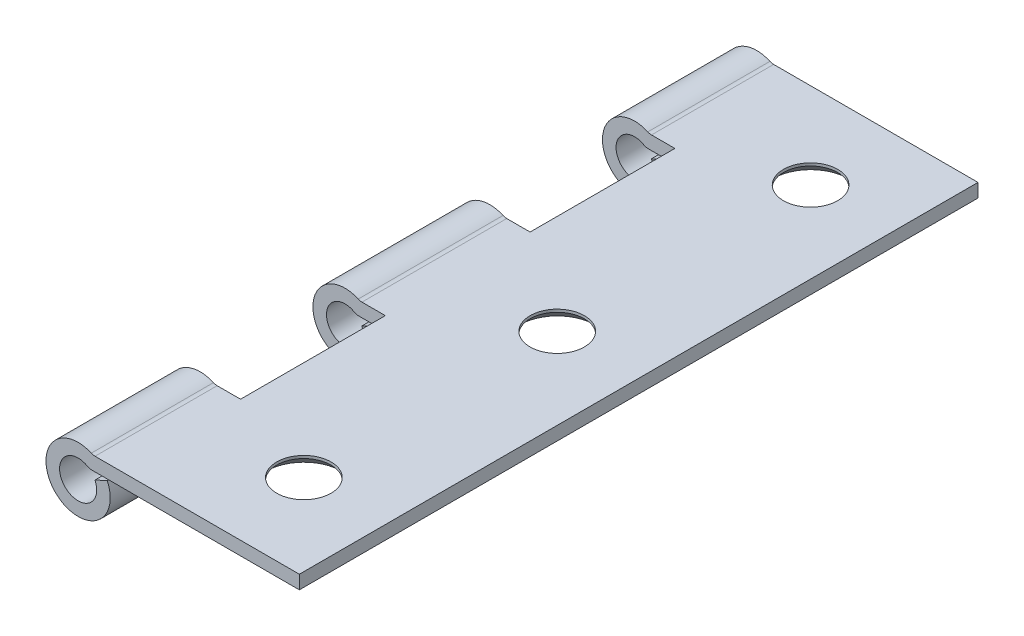
ISO-10303-21;
HEADER;
FILE_DESCRIPTION(('STEP AP214'),'2;1');
FILE_NAME('part.step','',(''),(''),'','','');
FILE_SCHEMA(('AUTOMOTIVE_DESIGN { 1 0 10303 214 1 1 1 1 }'));
ENDSEC;
DATA;
#1=APPLICATION_CONTEXT('core data for automotive mechanical design processes');
#2=APPLICATION_PROTOCOL_DEFINITION('international standard','automotive_design',2000,#1);
#3=PRODUCT_CONTEXT('',#1,'mechanical');
#4=PRODUCT('Part','Part','',(#3));
#5=PRODUCT_RELATED_PRODUCT_CATEGORY('part','',(#4));
#6=PRODUCT_DEFINITION_FORMATION('','',#4);
#7=PRODUCT_DEFINITION_CONTEXT('part definition',#1,'design');
#8=PRODUCT_DEFINITION('design','',#6,#7);
#9=PRODUCT_DEFINITION_SHAPE('','',#8);
#10=(LENGTH_UNIT() NAMED_UNIT(*) SI_UNIT(.MILLI.,.METRE.));
#11=(NAMED_UNIT(*) PLANE_ANGLE_UNIT() SI_UNIT($,.RADIAN.));
#12=(NAMED_UNIT(*) SI_UNIT($,.STERADIAN.) SOLID_ANGLE_UNIT());
#13=UNCERTAINTY_MEASURE_WITH_UNIT(LENGTH_MEASURE(1.E-05),#10,'distance_accuracy_value','');
#14=(GEOMETRIC_REPRESENTATION_CONTEXT(3) GLOBAL_UNCERTAINTY_ASSIGNED_CONTEXT((#13)) GLOBAL_UNIT_ASSIGNED_CONTEXT((#10,
#11,#12)) REPRESENTATION_CONTEXT('',''));
#15=CARTESIAN_POINT('',(0.,0.,0.));
#16=DIRECTION('',(0.,0.,1.));
#17=DIRECTION('',(1.,0.,0.));
#18=AXIS2_PLACEMENT_3D('',#15,#16,#17);
#19=CARTESIAN_POINT('',(3.21739264398012,1.50029482917946,37.5));
#20=DIRECTION('',(0.422618261740694,-0.906307787036653,0.));
#21=DIRECTION('',(0.906307787036653,0.422618261740694,0.));
#22=AXIS2_PLACEMENT_3D('',#19,#20,#21);
#23=PLANE('',#22);
#24=DIRECTION('',(0.906307787036653,0.422618261740694,0.));
#25=VECTOR('',#24,1.);
#26=CARTESIAN_POINT('',(3.21739264398012,1.50029482917946,24.));
#27=LINE('',#26,#25);
#28=CARTESIAN_POINT('',(1.85793096342514,0.866367436568422,24.));
#29=VERTEX_POINT('',#28);
#30=CARTESIAN_POINT('',(3.21739264398012,1.50029482917946,24.));
#31=VERTEX_POINT('',#30);
#32=EDGE_CURVE('E222',#29,#31,#27,.T.);
#33=ORIENTED_EDGE('',*,*,#32,.F.);
#34=DIRECTION('',(0.,0.,-1.));
#35=VECTOR('',#34,1.);
#36=CARTESIAN_POINT('',(1.85793096342514,0.866367436568422,37.5));
#37=LINE('',#36,#35);
#38=CARTESIAN_POINT('',(1.85793096342514,0.866367436568422,37.5));
#39=VERTEX_POINT('',#38);
#40=EDGE_CURVE('E338',#39,#29,#37,.T.);
#41=ORIENTED_EDGE('',*,*,#40,.F.);
#42=DIRECTION('',(-0.906307787036652,-0.422618261740694,0.));
#43=VECTOR('',#42,1.);
#44=CARTESIAN_POINT('',(3.21739264398012,1.50029482917946,37.5));
#45=LINE('',#44,#43);
#46=CARTESIAN_POINT('',(3.21739264398012,1.50029482917946,37.5));
#47=VERTEX_POINT('',#46);
#48=EDGE_CURVE('E275',#47,#39,#45,.T.);
#49=ORIENTED_EDGE('',*,*,#48,.F.);
#50=DIRECTION('',(0.,0.,-1.));
#51=VECTOR('',#50,1.);
#52=CARTESIAN_POINT('',(3.21739264398012,1.50029482917946,37.5));
#53=LINE('',#52,#51);
#54=EDGE_CURVE('E343',#47,#31,#53,.T.);
#55=ORIENTED_EDGE('',*,*,#54,.T.);
#56=EDGE_LOOP('',(#33,#41,#49,#55));
#57=FACE_BOUND('',#56,.T.);
#58=ADVANCED_FACE('F34',(#57),#23,.F.);
#59=DIRECTION('',(-0.906307787036653,-0.422618261740694,0.));
#60=VECTOR('',#59,1.);
#61=CARTESIAN_POINT('',(3.21739264398012,1.50029482917946,8.));
#62=LINE('',#61,#60);
#63=CARTESIAN_POINT('',(3.21739264398012,1.50029482917946,8.));
#64=VERTEX_POINT('',#63);
#65=CARTESIAN_POINT('',(1.85793096342514,0.866367436568422,8.));
#66=VERTEX_POINT('',#65);
#67=EDGE_CURVE('E424',#64,#66,#62,.T.);
#68=ORIENTED_EDGE('',*,*,#67,.F.);
#69=CARTESIAN_POINT('',(3.21739264398012,1.50029482917946,-8.));
#70=VERTEX_POINT('',#69);
#71=EDGE_CURVE('E347',#64,#70,#53,.T.);
#72=ORIENTED_EDGE('',*,*,#71,.T.);
#73=DIRECTION('',(-0.906307787036653,-0.422618261740694,0.));
#74=VECTOR('',#73,1.);
#75=CARTESIAN_POINT('',(3.21739264398012,1.50029482917946,-8.));
#76=LINE('',#75,#74);
#77=CARTESIAN_POINT('',(1.85793096342514,0.866367436568422,-8.));
#78=VERTEX_POINT('',#77);
#79=EDGE_CURVE('E256',#70,#78,#76,.T.);
#80=ORIENTED_EDGE('',*,*,#79,.T.);
#81=EDGE_CURVE('E342',#66,#78,#37,.T.);
#82=ORIENTED_EDGE('',*,*,#81,.F.);
#83=EDGE_LOOP('',(#68,#72,#80,#82));
#84=FACE_BOUND('',#83,.T.);
#85=ADVANCED_FACE('F423',(#84),#23,.F.);
#86=CARTESIAN_POINT('',(0.,0.,37.5));
#87=DIRECTION('',(0.,0.,-1.));
#88=DIRECTION('',(-1.,0.,0.));
#89=AXIS2_PLACEMENT_3D('',#86,#87,#88);
#90=CYLINDRICAL_SURFACE('',#89,2.05);
#91=CARTESIAN_POINT('',(0.,0.,24.));
#92=DIRECTION('',(0.,0.,-1.));
#93=DIRECTION('',(-1.,0.,0.));
#94=AXIS2_PLACEMENT_3D('',#91,#92,#93);
#95=CIRCLE('',#94,2.05);
#96=CARTESIAN_POINT('',(1.01489577654459,1.78114754098361,24.));
#97=VERTEX_POINT('',#96);
#98=EDGE_CURVE('E224',#97,#29,#95,.F.);
#99=ORIENTED_EDGE('',*,*,#98,.F.);
#100=DIRECTION('',(0.,0.,-1.));
#101=VECTOR('',#100,1.);
#102=CARTESIAN_POINT('',(1.01489577654459,1.78114754098361,37.5));
#103=LINE('',#102,#101);
#104=CARTESIAN_POINT('',(1.01489577654459,1.78114754098361,37.5));
#105=VERTEX_POINT('',#104);
#106=EDGE_CURVE('E333',#105,#97,#103,.T.);
#107=ORIENTED_EDGE('',*,*,#106,.F.);
#108=CARTESIAN_POINT('',(0.,0.,37.5));
#109=DIRECTION('',(0.,0.,-1.));
#110=DIRECTION('',(1.,0.,0.));
#111=AXIS2_PLACEMENT_3D('',#108,#109,#110);
#112=CIRCLE('',#111,2.05);
#113=EDGE_CURVE('E278',#39,#105,#112,.T.);
#114=ORIENTED_EDGE('',*,*,#113,.F.);
#115=ORIENTED_EDGE('',*,*,#40,.T.);
#116=EDGE_LOOP('',(#99,#107,#114,#115));
#117=FACE_BOUND('',#116,.T.);
#118=ADVANCED_FACE('F476',(#117),#90,.F.);
#119=CARTESIAN_POINT('',(0.,0.,8.));
#120=DIRECTION('',(0.,0.,1.));
#121=DIRECTION('',(1.,0.,0.));
#122=AXIS2_PLACEMENT_3D('',#119,#120,#121);
#123=CIRCLE('',#122,2.05);
#124=CARTESIAN_POINT('',(1.01489577654459,1.78114754098361,8.));
#125=VERTEX_POINT('',#124);
#126=EDGE_CURVE('E441',#66,#125,#123,.F.);
#127=ORIENTED_EDGE('',*,*,#126,.F.);
#128=ORIENTED_EDGE('',*,*,#81,.T.);
#129=CARTESIAN_POINT('',(0.,0.,-8.));
#130=DIRECTION('',(0.,0.,1.));
#131=DIRECTION('',(1.,0.,0.));
#132=AXIS2_PLACEMENT_3D('',#129,#130,#131);
#133=CIRCLE('',#132,2.05);
#134=CARTESIAN_POINT('',(1.01489577654459,1.78114754098361,-8.));
#135=VERTEX_POINT('',#134);
#136=EDGE_CURVE('E259',#78,#135,#133,.F.);
#137=ORIENTED_EDGE('',*,*,#136,.T.);
#138=EDGE_CURVE('E337',#125,#135,#103,.T.);
#139=ORIENTED_EDGE('',*,*,#138,.F.);
#140=EDGE_LOOP('',(#127,#128,#137,#139));
#141=FACE_BOUND('',#140,.T.);
#142=ADVANCED_FACE('F440',(#141),#90,.F.);
#143=CARTESIAN_POINT('',(1.50996688705415,2.65,37.5));
#144=DIRECTION('',(0.,0.,-1.));
#145=DIRECTION('',(-1.,0.,0.));
#146=AXIS2_PLACEMENT_3D('',#143,#144,#145);
#147=CYLINDRICAL_SURFACE('',#146,1.);
#148=CARTESIAN_POINT('',(1.50996688705415,2.65,24.));
#149=DIRECTION('',(0.,0.,-1.));
#150=DIRECTION('',(-1.,0.,0.));
#151=AXIS2_PLACEMENT_3D('',#148,#149,#150);
#152=CIRCLE('',#151,1.);
#153=CARTESIAN_POINT('',(1.50996688705415,1.65,24.));
#154=VERTEX_POINT('',#153);
#155=EDGE_CURVE('E226',#154,#97,#152,.T.);
#156=ORIENTED_EDGE('',*,*,#155,.F.);
#157=DIRECTION('',(0.,0.,-1.));
#158=VECTOR('',#157,1.);
#159=CARTESIAN_POINT('',(1.50996688705415,1.65,37.5));
#160=LINE('',#159,#158);
#161=CARTESIAN_POINT('',(1.50996688705415,1.65,37.5));
#162=VERTEX_POINT('',#161);
#163=EDGE_CURVE('E329',#162,#154,#160,.T.);
#164=ORIENTED_EDGE('',*,*,#163,.F.);
#165=CARTESIAN_POINT('',(1.50996688705415,2.65,37.5));
#166=DIRECTION('',(0.,0.,1.));
#167=DIRECTION('',(-1.,0.,0.));
#168=AXIS2_PLACEMENT_3D('',#165,#166,#167);
#169=CIRCLE('',#168,1.);
#170=EDGE_CURVE('E280',#105,#162,#169,.T.);
#171=ORIENTED_EDGE('',*,*,#170,.F.);
#172=ORIENTED_EDGE('',*,*,#106,.T.);
#173=EDGE_LOOP('',(#156,#164,#171,#172));
#174=FACE_BOUND('',#173,.T.);
#175=ADVANCED_FACE('F469',(#174),#147,.T.);
#176=CARTESIAN_POINT('',(1.50996688705415,2.65,8.));
#177=DIRECTION('',(0.,0.,1.));
#178=DIRECTION('',(1.,0.,0.));
#179=AXIS2_PLACEMENT_3D('',#176,#177,#178);
#180=CIRCLE('',#179,1.);
#181=CARTESIAN_POINT('',(1.50996688705415,1.65,8.));
#182=VERTEX_POINT('',#181);
#183=EDGE_CURVE('E197',#125,#182,#180,.T.);
#184=ORIENTED_EDGE('',*,*,#183,.F.);
#185=ORIENTED_EDGE('',*,*,#138,.T.);
#186=CARTESIAN_POINT('',(1.50996688705415,2.65,-8.));
#187=DIRECTION('',(0.,0.,1.));
#188=DIRECTION('',(1.,0.,0.));
#189=AXIS2_PLACEMENT_3D('',#186,#187,#188);
#190=CIRCLE('',#189,1.);
#191=CARTESIAN_POINT('',(1.50996688705415,1.65,-8.));
#192=VERTEX_POINT('',#191);
#193=EDGE_CURVE('E262',#135,#192,#190,.T.);
#194=ORIENTED_EDGE('',*,*,#193,.T.);
#195=EDGE_CURVE('E332',#182,#192,#160,.T.);
#196=ORIENTED_EDGE('',*,*,#195,.F.);
#197=EDGE_LOOP('',(#184,#185,#194,#196));
#198=FACE_BOUND('',#197,.T.);
#199=ADVANCED_FACE('F436',(#198),#147,.T.);
#200=CARTESIAN_POINT('',(1.86547581061776,4.15,37.5));
#201=DIRECTION('',(0.,0.,-1.));
#202=DIRECTION('',(-1.,0.,0.));
#203=AXIS2_PLACEMENT_3D('',#200,#201,#202);
#204=CYLINDRICAL_SURFACE('',#203,1.);
#205=CARTESIAN_POINT('',(1.86547581061776,4.15,24.));
#206=DIRECTION('',(0.,0.,-1.));
#207=DIRECTION('',(-1.,0.,0.));
#208=AXIS2_PLACEMENT_3D('',#205,#206,#207);
#209=CIRCLE('',#208,1.);
#210=CARTESIAN_POINT('',(1.45548112696551,3.23791208791209,24.));
#211=VERTEX_POINT('',#210);
#212=CARTESIAN_POINT('',(1.86547581061776,3.15,24.));
#213=VERTEX_POINT('',#212);
#214=EDGE_CURVE('E215',#211,#213,#209,.F.);
#215=ORIENTED_EDGE('',*,*,#214,.F.);
#216=DIRECTION('',(0.,0.,-1.));
#217=VECTOR('',#216,1.);
#218=CARTESIAN_POINT('',(1.45548112696551,3.23791208791209,37.5));
#219=LINE('',#218,#217);
#220=CARTESIAN_POINT('',(1.45548112696551,3.23791208791209,37.5));
#221=VERTEX_POINT('',#220);
#222=EDGE_CURVE('E313',#221,#211,#219,.T.);
#223=ORIENTED_EDGE('',*,*,#222,.F.);
#224=CARTESIAN_POINT('',(1.86547581061776,4.15,37.5));
#225=DIRECTION('',(0.,0.,-1.));
#226=DIRECTION('',(-1.,0.,0.));
#227=AXIS2_PLACEMENT_3D('',#224,#225,#226);
#228=CIRCLE('',#227,1.);
#229=CARTESIAN_POINT('',(1.86547581061776,3.15,37.5));
#230=VERTEX_POINT('',#229);
#231=EDGE_CURVE('E288',#230,#221,#228,.T.);
#232=ORIENTED_EDGE('',*,*,#231,.F.);
#233=DIRECTION('',(0.,0.,-1.));
#234=VECTOR('',#233,1.);
#235=CARTESIAN_POINT('',(1.86547581061776,3.15,37.5));
#236=LINE('',#235,#234);
#237=EDGE_CURVE('E318',#230,#213,#236,.T.);
#238=ORIENTED_EDGE('',*,*,#237,.T.);
#239=EDGE_LOOP('',(#215,#223,#232,#238));
#240=FACE_BOUND('',#239,.T.);
#241=ADVANCED_FACE('F453',(#240),#204,.F.);
#242=CARTESIAN_POINT('',(1.86547581061776,4.15,8.));
#243=DIRECTION('',(0.,0.,1.));
#244=DIRECTION('',(1.,0.,0.));
#245=AXIS2_PLACEMENT_3D('',#242,#243,#244);
#246=CIRCLE('',#245,1.);
#247=CARTESIAN_POINT('',(1.86547581061776,3.15,8.));
#248=VERTEX_POINT('',#247);
#249=CARTESIAN_POINT('',(1.45548112696551,3.23791208791209,8.));
#250=VERTEX_POINT('',#249);
#251=EDGE_CURVE('E383',#248,#250,#246,.F.);
#252=ORIENTED_EDGE('',*,*,#251,.F.);
#253=CARTESIAN_POINT('',(1.86547581061776,3.15,-8.));
#254=VERTEX_POINT('',#253);
#255=EDGE_CURVE('E322',#248,#254,#236,.T.);
#256=ORIENTED_EDGE('',*,*,#255,.T.);
#257=CARTESIAN_POINT('',(1.86547581061776,4.15,-8.));
#258=DIRECTION('',(0.,0.,1.));
#259=DIRECTION('',(1.,0.,0.));
#260=AXIS2_PLACEMENT_3D('',#257,#258,#259);
#261=CIRCLE('',#260,1.);
#262=CARTESIAN_POINT('',(1.45548112696551,3.23791208791209,-8.));
#263=VERTEX_POINT('',#262);
#264=EDGE_CURVE('E374',#254,#263,#261,.F.);
#265=ORIENTED_EDGE('',*,*,#264,.T.);
#266=EDGE_CURVE('E317',#250,#263,#219,.T.);
#267=ORIENTED_EDGE('',*,*,#266,.F.);
#268=EDGE_LOOP('',(#252,#256,#265,#267));
#269=FACE_BOUND('',#268,.T.);
#270=ADVANCED_FACE('F388',(#269),#204,.F.);
#271=CARTESIAN_POINT('',(0.,0.,37.5));
#272=DIRECTION('',(0.,0.,-1.));
#273=DIRECTION('',(-1.,0.,0.));
#274=AXIS2_PLACEMENT_3D('',#271,#272,#273);
#275=CYLINDRICAL_SURFACE('',#274,3.55);
#276=ORIENTED_EDGE('',*,*,#222,.T.);
#277=CARTESIAN_POINT('',(0.,0.,24.));
#278=DIRECTION('',(0.,0.,-1.));
#279=DIRECTION('',(-1.,0.,0.));
#280=AXIS2_PLACEMENT_3D('',#277,#278,#279);
#281=CIRCLE('',#280,3.55);
#282=EDGE_CURVE('E217',#31,#211,#281,.T.);
#283=ORIENTED_EDGE('',*,*,#282,.F.);
#284=ORIENTED_EDGE('',*,*,#54,.F.);
#285=CARTESIAN_POINT('',(0.,0.,37.5));
#286=DIRECTION('',(0.,0.,1.));
#287=DIRECTION('',(1.,0.,0.));
#288=AXIS2_PLACEMENT_3D('',#285,#286,#287);
#289=CIRCLE('',#288,3.55);
#290=EDGE_CURVE('E272',#221,#47,#289,.T.);
#291=ORIENTED_EDGE('',*,*,#290,.F.);
#292=EDGE_LOOP('',(#276,#283,#284,#291));
#293=FACE_BOUND('',#292,.T.);
#294=ADVANCED_FACE('F493',(#293),#275,.T.);
#295=CARTESIAN_POINT('',(0.,0.,8.));
#296=DIRECTION('',(0.,0.,1.));
#297=DIRECTION('',(1.,0.,0.));
#298=AXIS2_PLACEMENT_3D('',#295,#296,#297);
#299=CIRCLE('',#298,3.55);
#300=EDGE_CURVE('E390',#250,#64,#299,.T.);
#301=ORIENTED_EDGE('',*,*,#300,.F.);
#302=ORIENTED_EDGE('',*,*,#266,.T.);
#303=CARTESIAN_POINT('',(0.,0.,-8.));
#304=DIRECTION('',(0.,0.,1.));
#305=DIRECTION('',(1.,0.,0.));
#306=AXIS2_PLACEMENT_3D('',#303,#304,#305);
#307=CIRCLE('',#306,3.55);
#308=EDGE_CURVE('E253',#263,#70,#307,.T.);
#309=ORIENTED_EDGE('',*,*,#308,.T.);
#310=ORIENTED_EDGE('',*,*,#71,.F.);
#311=EDGE_LOOP('',(#301,#302,#309,#310));
#312=FACE_BOUND('',#311,.T.);
#313=ADVANCED_FACE('F413',(#312),#275,.T.);
#314=CARTESIAN_POINT('',(1.50996688705415,1.65,37.5));
#315=DIRECTION('',(0.,1.,0.));
#316=DIRECTION('',(0.,0.,1.));
#317=AXIS2_PLACEMENT_3D('',#314,#315,#316);
#318=PLANE('',#317);
#319=CARTESIAN_POINT('',(15.45,1.65,28.));
#320=DIRECTION('',(0.,1.,0.));
#321=DIRECTION('',(0.,0.,1.));
#322=AXIS2_PLACEMENT_3D('',#319,#320,#321);
#323=CIRCLE('',#322,4.19999999999998);
#324=CARTESIAN_POINT('',(15.45,1.65,32.2));
#325=VERTEX_POINT('',#324);
#326=EDGE_CURVE('E357',#325,#325,#323,.T.);
#327=ORIENTED_EDGE('',*,*,#326,.T.);
#328=EDGE_LOOP('',(#327));
#329=FACE_BOUND('',#328,.T.);
#330=CARTESIAN_POINT('',(15.45,1.65,0.));
#331=DIRECTION('',(0.,1.,0.));
#332=DIRECTION('',(0.,0.,1.));
#333=AXIS2_PLACEMENT_3D('',#330,#331,#332);
#334=CIRCLE('',#333,4.20000000000003);
#335=CARTESIAN_POINT('',(15.45,1.65,4.20000000000003));
#336=VERTEX_POINT('',#335);
#337=EDGE_CURVE('E360',#336,#336,#334,.T.);
#338=ORIENTED_EDGE('',*,*,#337,.T.);
#339=EDGE_LOOP('',(#338));
#340=FACE_BOUND('',#339,.T.);
#341=CARTESIAN_POINT('',(15.45,1.65,-28.));
#342=DIRECTION('',(0.,1.,0.));
#343=DIRECTION('',(0.,0.,1.));
#344=AXIS2_PLACEMENT_3D('',#341,#342,#343);
#345=CIRCLE('',#344,4.20000000000001);
#346=CARTESIAN_POINT('',(15.45,1.65,-23.8));
#347=VERTEX_POINT('',#346);
#348=EDGE_CURVE('E363',#347,#347,#345,.T.);
#349=ORIENTED_EDGE('',*,*,#348,.T.);
#350=EDGE_LOOP('',(#349));
#351=FACE_BOUND('',#350,.T.);
#352=DIRECTION('',(-1.,0.,0.));
#353=VECTOR('',#352,1.);
#354=CARTESIAN_POINT('',(1.50996688705415,1.65,24.));
#355=LINE('',#354,#353);
#356=CARTESIAN_POINT('',(4.45,1.65,24.));
#357=VERTEX_POINT('',#356);
#358=EDGE_CURVE('E214',#357,#154,#355,.T.);
#359=ORIENTED_EDGE('',*,*,#358,.F.);
#360=DIRECTION('',(0.,0.,1.));
#361=VECTOR('',#360,1.);
#362=CARTESIAN_POINT('',(4.45,1.65,37.5));
#363=LINE('',#362,#361);
#364=CARTESIAN_POINT('',(4.45,1.65,8.));
#365=VERTEX_POINT('',#364);
#366=EDGE_CURVE('E201',#365,#357,#363,.T.);
#367=ORIENTED_EDGE('',*,*,#366,.F.);
#368=DIRECTION('',(1.,0.,0.));
#369=VECTOR('',#368,1.);
#370=CARTESIAN_POINT('',(1.50996688705415,1.65,8.));
#371=LINE('',#370,#369);
#372=EDGE_CURVE('E194',#182,#365,#371,.T.);
#373=ORIENTED_EDGE('',*,*,#372,.F.);
#374=ORIENTED_EDGE('',*,*,#195,.T.);
#375=DIRECTION('',(1.,0.,0.));
#376=VECTOR('',#375,1.);
#377=CARTESIAN_POINT('',(1.50996688705415,1.65,-8.));
#378=LINE('',#377,#376);
#379=CARTESIAN_POINT('',(4.45,1.65,-8.));
#380=VERTEX_POINT('',#379);
#381=EDGE_CURVE('E265',#192,#380,#378,.T.);
#382=ORIENTED_EDGE('',*,*,#381,.T.);
#383=DIRECTION('',(0.,0.,-1.));
#384=VECTOR('',#383,1.);
#385=CARTESIAN_POINT('',(4.44999999999999,1.65,37.5));
#386=LINE('',#385,#384);
#387=CARTESIAN_POINT('',(4.45,1.65,-24.));
#388=VERTEX_POINT('',#387);
#389=EDGE_CURVE('E268',#380,#388,#386,.T.);
#390=ORIENTED_EDGE('',*,*,#389,.T.);
#391=DIRECTION('',(-1.,0.,0.));
#392=VECTOR('',#391,1.);
#393=CARTESIAN_POINT('',(1.50996688705415,1.65,-24.));
#394=LINE('',#393,#392);
#395=CARTESIAN_POINT('',(1.50996688705415,1.65,-24.));
#396=VERTEX_POINT('',#395);
#397=EDGE_CURVE('E247',#388,#396,#394,.T.);
#398=ORIENTED_EDGE('',*,*,#397,.T.);
#399=CARTESIAN_POINT('',(1.50996688705415,1.65,-37.5));
#400=VERTEX_POINT('',#399);
#401=EDGE_CURVE('E328',#396,#400,#160,.T.);
#402=ORIENTED_EDGE('',*,*,#401,.T.);
#403=DIRECTION('',(1.,0.,0.));
#404=VECTOR('',#403,1.);
#405=CARTESIAN_POINT('',(1.50996688705415,1.65,-37.5));
#406=LINE('',#405,#404);
#407=CARTESIAN_POINT('',(24.45,1.65,-37.5));
#408=VERTEX_POINT('',#407);
#409=EDGE_CURVE('E304',#400,#408,#406,.T.);
#410=ORIENTED_EDGE('',*,*,#409,.T.);
#411=DIRECTION('',(0.,0.,-1.));
#412=VECTOR('',#411,1.);
#413=CARTESIAN_POINT('',(24.45,1.65,37.5));
#414=LINE('',#413,#412);
#415=CARTESIAN_POINT('',(24.45,1.65,37.5));
#416=VERTEX_POINT('',#415);
#417=EDGE_CURVE('E325',#416,#408,#414,.T.);
#418=ORIENTED_EDGE('',*,*,#417,.F.);
#419=DIRECTION('',(1.,0.,0.));
#420=VECTOR('',#419,1.);
#421=CARTESIAN_POINT('',(1.50996688705415,1.65,37.5));
#422=LINE('',#421,#420);
#423=EDGE_CURVE('E282',#162,#416,#422,.T.);
#424=ORIENTED_EDGE('',*,*,#423,.F.);
#425=ORIENTED_EDGE('',*,*,#163,.T.);
#426=EDGE_LOOP('',(#359,#367,#373,#374,#382,#390,#398,#402,#410,#418,#424,#425));
#427=FACE_BOUND('',#426,.T.);
#428=ADVANCED_FACE('F212',(#329,#340,#351,#427),#318,.F.);
#429=CARTESIAN_POINT('',(1.86547581061776,3.15,37.5));
#430=DIRECTION('',(0.,-1.,0.));
#431=DIRECTION('',(1.,0.,0.));
#432=AXIS2_PLACEMENT_3D('',#429,#430,#431);
#433=PLANE('',#432);
#434=CARTESIAN_POINT('',(15.45,3.15,0.));
#435=DIRECTION('',(0.,-1.,0.));
#436=DIRECTION('',(1.,0.,0.));
#437=AXIS2_PLACEMENT_3D('',#434,#435,#436);
#438=CIRCLE('',#437,3.);
#439=CARTESIAN_POINT('',(18.45,3.15,0.));
#440=VERTEX_POINT('',#439);
#441=EDGE_CURVE('E295',#440,#440,#438,.T.);
#442=ORIENTED_EDGE('',*,*,#441,.T.);
#443=EDGE_LOOP('',(#442));
#444=FACE_BOUND('',#443,.T.);
#445=CARTESIAN_POINT('',(15.45,3.15,-28.));
#446=DIRECTION('',(0.,-1.,0.));
#447=DIRECTION('',(1.,0.,0.));
#448=AXIS2_PLACEMENT_3D('',#445,#446,#447);
#449=CIRCLE('',#448,3.);
#450=CARTESIAN_POINT('',(18.45,3.15,-28.));
#451=VERTEX_POINT('',#450);
#452=EDGE_CURVE('E350',#451,#451,#449,.T.);
#453=ORIENTED_EDGE('',*,*,#452,.T.);
#454=EDGE_LOOP('',(#453));
#455=FACE_BOUND('',#454,.T.);
#456=CARTESIAN_POINT('',(15.45,3.15,28.));
#457=DIRECTION('',(0.,-1.,0.));
#458=DIRECTION('',(1.,0.,0.));
#459=AXIS2_PLACEMENT_3D('',#456,#457,#458);
#460=CIRCLE('',#459,3.);
#461=CARTESIAN_POINT('',(18.45,3.15,28.));
#462=VERTEX_POINT('',#461);
#463=EDGE_CURVE('E271',#462,#462,#460,.F.);
#464=ORIENTED_EDGE('',*,*,#463,.F.);
#465=EDGE_LOOP('',(#464));
#466=FACE_BOUND('',#465,.T.);
#467=DIRECTION('',(1.,0.,0.));
#468=VECTOR('',#467,1.);
#469=CARTESIAN_POINT('',(1.86547581061776,3.15,24.));
#470=LINE('',#469,#468);
#471=CARTESIAN_POINT('',(4.45,3.15,24.));
#472=VERTEX_POINT('',#471);
#473=EDGE_CURVE('E11',#213,#472,#470,.T.);
#474=ORIENTED_EDGE('',*,*,#473,.F.);
#475=ORIENTED_EDGE('',*,*,#237,.F.);
#476=DIRECTION('',(-1.,0.,0.));
#477=VECTOR('',#476,1.);
#478=CARTESIAN_POINT('',(1.86547581061776,3.15,37.5));
#479=LINE('',#478,#477);
#480=CARTESIAN_POINT('',(24.45,3.15,37.5));
#481=VERTEX_POINT('',#480);
#482=EDGE_CURVE('E286',#481,#230,#479,.T.);
#483=ORIENTED_EDGE('',*,*,#482,.F.);
#484=DIRECTION('',(0.,0.,-1.));
#485=VECTOR('',#484,1.);
#486=CARTESIAN_POINT('',(24.45,3.15,37.5));
#487=LINE('',#486,#485);
#488=CARTESIAN_POINT('',(24.45,3.15,-37.5));
#489=VERTEX_POINT('',#488);
#490=EDGE_CURVE('E321',#481,#489,#487,.T.);
#491=ORIENTED_EDGE('',*,*,#490,.T.);
#492=DIRECTION('',(-1.,0.,0.));
#493=VECTOR('',#492,1.);
#494=CARTESIAN_POINT('',(1.86547581061776,3.15,-37.5));
#495=LINE('',#494,#493);
#496=CARTESIAN_POINT('',(1.86547581061776,3.15,-37.5));
#497=VERTEX_POINT('',#496);
#498=EDGE_CURVE('E308',#489,#497,#495,.T.);
#499=ORIENTED_EDGE('',*,*,#498,.T.);
#500=CARTESIAN_POINT('',(1.86547581061776,3.15,-24.));
#501=VERTEX_POINT('',#500);
#502=EDGE_CURVE('E316',#501,#497,#236,.T.);
#503=ORIENTED_EDGE('',*,*,#502,.F.);
#504=DIRECTION('',(1.,0.,0.));
#505=VECTOR('',#504,1.);
#506=CARTESIAN_POINT('',(1.86547581061776,3.15,-24.));
#507=LINE('',#506,#505);
#508=CARTESIAN_POINT('',(4.45,3.15,-24.));
#509=VERTEX_POINT('',#508);
#510=EDGE_CURVE('E57',#501,#509,#507,.T.);
#511=ORIENTED_EDGE('',*,*,#510,.T.);
#512=DIRECTION('',(0.,0.,1.));
#513=VECTOR('',#512,1.);
#514=CARTESIAN_POINT('',(4.44999999999999,3.15,37.5));
#515=LINE('',#514,#513);
#516=CARTESIAN_POINT('',(4.45,3.15,-8.));
#517=VERTEX_POINT('',#516);
#518=EDGE_CURVE('E377',#509,#517,#515,.T.);
#519=ORIENTED_EDGE('',*,*,#518,.T.);
#520=DIRECTION('',(-1.,0.,0.));
#521=VECTOR('',#520,1.);
#522=CARTESIAN_POINT('',(1.86547581061776,3.15,-8.));
#523=LINE('',#522,#521);
#524=EDGE_CURVE('E250',#517,#254,#523,.T.);
#525=ORIENTED_EDGE('',*,*,#524,.T.);
#526=ORIENTED_EDGE('',*,*,#255,.F.);
#527=DIRECTION('',(-1.,0.,0.));
#528=VECTOR('',#527,1.);
#529=CARTESIAN_POINT('',(1.86547581061776,3.15,8.));
#530=LINE('',#529,#528);
#531=CARTESIAN_POINT('',(4.45,3.15,8.));
#532=VERTEX_POINT('',#531);
#533=EDGE_CURVE('E380',#532,#248,#530,.T.);
#534=ORIENTED_EDGE('',*,*,#533,.F.);
#535=DIRECTION('',(0.,0.,-1.));
#536=VECTOR('',#535,1.);
#537=CARTESIAN_POINT('',(4.45,3.15,37.5));
#538=LINE('',#537,#536);
#539=EDGE_CURVE('E42',#472,#532,#538,.T.);
#540=ORIENTED_EDGE('',*,*,#539,.F.);
#541=EDGE_LOOP('',(#474,#475,#483,#491,#499,#503,#511,#519,#525,#526,#534,#540));
#542=FACE_BOUND('',#541,.T.);
#543=ADVANCED_FACE('F393',(#444,#455,#466,#542),#433,.F.);
#544=CARTESIAN_POINT('',(0.,0.,-24.));
#545=DIRECTION('',(0.,0.,-1.));
#546=DIRECTION('',(-1.,0.,0.));
#547=AXIS2_PLACEMENT_3D('',#544,#545,#546);
#548=CIRCLE('',#547,3.55);
#549=CARTESIAN_POINT('',(3.21739264398012,1.50029482917946,-24.));
#550=VERTEX_POINT('',#549);
#551=CARTESIAN_POINT('',(1.45548112696551,3.23791208791209,-24.));
#552=VERTEX_POINT('',#551);
#553=EDGE_CURVE('E236',#550,#552,#548,.T.);
#554=ORIENTED_EDGE('',*,*,#553,.T.);
#555=CARTESIAN_POINT('',(1.45548112696551,3.23791208791209,-37.5));
#556=VERTEX_POINT('',#555);
#557=EDGE_CURVE('E290',#552,#556,#219,.T.);
#558=ORIENTED_EDGE('',*,*,#557,.T.);
#559=CARTESIAN_POINT('',(0.,0.,-37.5));
#560=DIRECTION('',(0.,0.,1.));
#561=DIRECTION('',(1.,0.,0.));
#562=AXIS2_PLACEMENT_3D('',#559,#560,#561);
#563=CIRCLE('',#562,3.55);
#564=CARTESIAN_POINT('',(3.21739264398012,1.50029482917946,-37.5));
#565=VERTEX_POINT('',#564);
#566=EDGE_CURVE('E291',#556,#565,#563,.T.);
#567=ORIENTED_EDGE('',*,*,#566,.T.);
#568=EDGE_CURVE('E341',#550,#565,#53,.T.);
#569=ORIENTED_EDGE('',*,*,#568,.F.);
#570=EDGE_LOOP('',(#554,#558,#567,#569));
#571=FACE_BOUND('',#570,.T.);
#572=ADVANCED_FACE('F410',(#571),#275,.T.);
#573=CARTESIAN_POINT('',(1.85793096342514,0.866367436568422,-24.));
#574=VERTEX_POINT('',#573);
#575=CARTESIAN_POINT('',(1.85793096342514,0.866367436568422,-37.5));
#576=VERTEX_POINT('',#575);
#577=EDGE_CURVE('E336',#574,#576,#37,.T.);
#578=ORIENTED_EDGE('',*,*,#577,.F.);
#579=DIRECTION('',(0.906307787036653,0.422618261740694,0.));
#580=VECTOR('',#579,1.);
#581=CARTESIAN_POINT('',(3.21739264398012,1.50029482917946,-24.));
#582=LINE('',#581,#580);
#583=EDGE_CURVE('E238',#574,#550,#582,.T.);
#584=ORIENTED_EDGE('',*,*,#583,.T.);
#585=ORIENTED_EDGE('',*,*,#568,.T.);
#586=DIRECTION('',(-0.906307787036652,-0.422618261740694,0.));
#587=VECTOR('',#586,1.);
#588=CARTESIAN_POINT('',(3.21739264398012,1.50029482917946,-37.5));
#589=LINE('',#588,#587);
#590=EDGE_CURVE('E294',#565,#576,#589,.T.);
#591=ORIENTED_EDGE('',*,*,#590,.T.);
#592=EDGE_LOOP('',(#578,#584,#585,#591));
#593=FACE_BOUND('',#592,.T.);
#594=ADVANCED_FACE('F427',(#593),#23,.F.);
#595=CARTESIAN_POINT('',(1.01489577654459,1.78114754098361,-24.));
#596=VERTEX_POINT('',#595);
#597=CARTESIAN_POINT('',(1.01489577654459,1.78114754098361,-37.5));
#598=VERTEX_POINT('',#597);
#599=EDGE_CURVE('E331',#596,#598,#103,.T.);
#600=ORIENTED_EDGE('',*,*,#599,.F.);
#601=CARTESIAN_POINT('',(0.,0.,-24.));
#602=DIRECTION('',(0.,0.,-1.));
#603=DIRECTION('',(-1.,0.,0.));
#604=AXIS2_PLACEMENT_3D('',#601,#602,#603);
#605=CIRCLE('',#604,2.05);
#606=EDGE_CURVE('E241',#596,#574,#605,.F.);
#607=ORIENTED_EDGE('',*,*,#606,.T.);
#608=ORIENTED_EDGE('',*,*,#577,.T.);
#609=CARTESIAN_POINT('',(0.,0.,-37.5));
#610=DIRECTION('',(0.,0.,-1.));
#611=DIRECTION('',(1.,0.,0.));
#612=AXIS2_PLACEMENT_3D('',#609,#610,#611);
#613=CIRCLE('',#612,2.05);
#614=EDGE_CURVE('E298',#576,#598,#613,.T.);
#615=ORIENTED_EDGE('',*,*,#614,.T.);
#616=EDGE_LOOP('',(#600,#607,#608,#615));
#617=FACE_BOUND('',#616,.T.);
#618=ADVANCED_FACE('F431',(#617),#90,.F.);
#619=ORIENTED_EDGE('',*,*,#401,.F.);
#620=CARTESIAN_POINT('',(1.50996688705415,2.65,-24.));
#621=DIRECTION('',(0.,0.,-1.));
#622=DIRECTION('',(-1.,0.,0.));
#623=AXIS2_PLACEMENT_3D('',#620,#621,#622);
#624=CIRCLE('',#623,1.);
#625=EDGE_CURVE('E244',#396,#596,#624,.T.);
#626=ORIENTED_EDGE('',*,*,#625,.T.);
#627=ORIENTED_EDGE('',*,*,#599,.T.);
#628=CARTESIAN_POINT('',(1.50996688705415,2.65,-37.5));
#629=DIRECTION('',(0.,0.,1.));
#630=DIRECTION('',(-1.,0.,0.));
#631=AXIS2_PLACEMENT_3D('',#628,#629,#630);
#632=CIRCLE('',#631,1.);
#633=EDGE_CURVE('E301',#598,#400,#632,.T.);
#634=ORIENTED_EDGE('',*,*,#633,.T.);
#635=EDGE_LOOP('',(#619,#626,#627,#634));
#636=FACE_BOUND('',#635,.T.);
#637=ADVANCED_FACE('F466',(#636),#147,.T.);
#638=CARTESIAN_POINT('',(24.45,3.15,37.5));
#639=DIRECTION('',(-1.,0.,0.));
#640=DIRECTION('',(0.,0.,1.));
#641=AXIS2_PLACEMENT_3D('',#638,#639,#640);
#642=PLANE('',#641);
#643=DIRECTION('',(0.,1.,0.));
#644=VECTOR('',#643,1.);
#645=CARTESIAN_POINT('',(24.45,3.15,-37.5));
#646=LINE('',#645,#644);
#647=EDGE_CURVE('E306',#408,#489,#646,.T.);
#648=ORIENTED_EDGE('',*,*,#647,.T.);
#649=ORIENTED_EDGE('',*,*,#490,.F.);
#650=DIRECTION('',(0.,1.,0.));
#651=VECTOR('',#650,1.);
#652=CARTESIAN_POINT('',(24.45,3.15,37.5));
#653=LINE('',#652,#651);
#654=EDGE_CURVE('E284',#416,#481,#653,.T.);
#655=ORIENTED_EDGE('',*,*,#654,.F.);
#656=ORIENTED_EDGE('',*,*,#417,.T.);
#657=EDGE_LOOP('',(#648,#649,#655,#656));
#658=FACE_BOUND('',#657,.T.);
#659=ADVANCED_FACE('F463',(#658),#642,.F.);
#660=ORIENTED_EDGE('',*,*,#557,.F.);
#661=CARTESIAN_POINT('',(1.86547581061776,4.15,-24.));
#662=DIRECTION('',(0.,0.,-1.));
#663=DIRECTION('',(-1.,0.,0.));
#664=AXIS2_PLACEMENT_3D('',#661,#662,#663);
#665=CIRCLE('',#664,1.);
#666=EDGE_CURVE('E372',#552,#501,#665,.F.);
#667=ORIENTED_EDGE('',*,*,#666,.T.);
#668=ORIENTED_EDGE('',*,*,#502,.T.);
#669=CARTESIAN_POINT('',(1.86547581061776,4.15,-37.5));
#670=DIRECTION('',(0.,0.,-1.));
#671=DIRECTION('',(-1.,0.,0.));
#672=AXIS2_PLACEMENT_3D('',#669,#670,#671);
#673=CIRCLE('',#672,1.);
#674=EDGE_CURVE('E276',#497,#556,#673,.T.);
#675=ORIENTED_EDGE('',*,*,#674,.T.);
#676=EDGE_LOOP('',(#660,#667,#668,#675));
#677=FACE_BOUND('',#676,.T.);
#678=ADVANCED_FACE('F397',(#677),#204,.F.);
#679=CARTESIAN_POINT('',(0.,0.,37.5));
#680=DIRECTION('',(0.,0.,1.));
#681=DIRECTION('',(1.,0.,0.));
#682=AXIS2_PLACEMENT_3D('',#679,#680,#681);
#683=PLANE('',#682);
#684=ORIENTED_EDGE('',*,*,#290,.T.);
#685=ORIENTED_EDGE('',*,*,#48,.T.);
#686=ORIENTED_EDGE('',*,*,#113,.T.);
#687=ORIENTED_EDGE('',*,*,#170,.T.);
#688=ORIENTED_EDGE('',*,*,#423,.T.);
#689=ORIENTED_EDGE('',*,*,#654,.T.);
#690=ORIENTED_EDGE('',*,*,#482,.T.);
#691=ORIENTED_EDGE('',*,*,#231,.T.);
#692=EDGE_LOOP('',(#684,#685,#686,#687,#688,#689,#690,#691));
#693=FACE_BOUND('',#692,.T.);
#694=ADVANCED_FACE('F457',(#693),#683,.T.);
#695=CARTESIAN_POINT('',(0.,0.,-37.5));
#696=DIRECTION('',(0.,0.,1.));
#697=DIRECTION('',(1.,0.,0.));
#698=AXIS2_PLACEMENT_3D('',#695,#696,#697);
#699=PLANE('',#698);
#700=ORIENTED_EDGE('',*,*,#566,.F.);
#701=ORIENTED_EDGE('',*,*,#674,.F.);
#702=ORIENTED_EDGE('',*,*,#498,.F.);
#703=ORIENTED_EDGE('',*,*,#647,.F.);
#704=ORIENTED_EDGE('',*,*,#409,.F.);
#705=ORIENTED_EDGE('',*,*,#633,.F.);
#706=ORIENTED_EDGE('',*,*,#614,.F.);
#707=ORIENTED_EDGE('',*,*,#590,.F.);
#708=EDGE_LOOP('',(#700,#701,#702,#703,#704,#705,#706,#707));
#709=FACE_BOUND('',#708,.T.);
#710=ADVANCED_FACE('F405',(#709),#699,.F.);
#711=CARTESIAN_POINT('',(15.45,3.55,0.));
#712=DIRECTION('',(0.,-1.,0.));
#713=DIRECTION('',(0.,0.,-1.));
#714=AXIS2_PLACEMENT_3D('',#711,#712,#713);
#715=CYLINDRICAL_SURFACE('',#714,3.);
#716=CARTESIAN_POINT('',(15.45,2.85000000000003,0.));
#717=DIRECTION('',(0.,1.,0.));
#718=DIRECTION('',(0.,0.,1.));
#719=AXIS2_PLACEMENT_3D('',#716,#717,#718);
#720=CIRCLE('',#719,3.);
#721=CARTESIAN_POINT('',(15.45,2.85000000000003,3.));
#722=VERTEX_POINT('',#721);
#723=EDGE_CURVE('E366',#722,#722,#720,.F.);
#724=ORIENTED_EDGE('',*,*,#723,.T.);
#725=EDGE_LOOP('',(#724));
#726=FACE_BOUND('',#725,.T.);
#727=ORIENTED_EDGE('',*,*,#441,.F.);
#728=EDGE_LOOP('',(#727));
#729=FACE_BOUND('',#728,.T.);
#730=ADVANCED_FACE('F515',(#726,#729),#715,.F.);
#731=CARTESIAN_POINT('',(15.45,3.55,-28.));
#732=DIRECTION('',(0.,-1.,0.));
#733=DIRECTION('',(0.,0.,-1.));
#734=AXIS2_PLACEMENT_3D('',#731,#732,#733);
#735=CYLINDRICAL_SURFACE('',#734,3.);
#736=CARTESIAN_POINT('',(15.45,2.85000000000001,-28.));
#737=DIRECTION('',(0.,1.,0.));
#738=DIRECTION('',(0.,0.,1.));
#739=AXIS2_PLACEMENT_3D('',#736,#737,#738);
#740=CIRCLE('',#739,3.);
#741=CARTESIAN_POINT('',(15.45,2.85000000000001,-25.));
#742=VERTEX_POINT('',#741);
#743=EDGE_CURVE('E346',#742,#742,#740,.F.);
#744=ORIENTED_EDGE('',*,*,#743,.T.);
#745=EDGE_LOOP('',(#744));
#746=FACE_BOUND('',#745,.T.);
#747=ORIENTED_EDGE('',*,*,#452,.F.);
#748=EDGE_LOOP('',(#747));
#749=FACE_BOUND('',#748,.T.);
#750=ADVANCED_FACE('F520',(#746,#749),#735,.F.);
#751=CARTESIAN_POINT('',(15.45,3.55,28.));
#752=DIRECTION('',(0.,-1.,0.));
#753=DIRECTION('',(0.,0.,-1.));
#754=AXIS2_PLACEMENT_3D('',#751,#752,#753);
#755=CYLINDRICAL_SURFACE('',#754,3.);
#756=CARTESIAN_POINT('',(15.45,2.84999999999998,28.));
#757=DIRECTION('',(0.,1.,0.));
#758=DIRECTION('',(0.,0.,1.));
#759=AXIS2_PLACEMENT_3D('',#756,#757,#758);
#760=CIRCLE('',#759,3.);
#761=CARTESIAN_POINT('',(15.45,2.84999999999998,31.));
#762=VERTEX_POINT('',#761);
#763=EDGE_CURVE('E369',#762,#762,#760,.F.);
#764=ORIENTED_EDGE('',*,*,#763,.T.);
#765=EDGE_LOOP('',(#764));
#766=FACE_BOUND('',#765,.T.);
#767=ORIENTED_EDGE('',*,*,#463,.T.);
#768=EDGE_LOOP('',(#767));
#769=FACE_BOUND('',#768,.T.);
#770=ADVANCED_FACE('F524',(#766,#769),#755,.F.);
#771=CARTESIAN_POINT('',(15.45,2.85000000000001,-28.));
#772=DIRECTION('',(0.,-1.,0.));
#773=DIRECTION('',(0.,0.,-1.));
#774=AXIS2_PLACEMENT_3D('',#771,#772,#773);
#775=CONICAL_SURFACE('',#774,3.,0.78539816339745);
#776=ORIENTED_EDGE('',*,*,#348,.F.);
#777=EDGE_LOOP('',(#776));
#778=FACE_BOUND('',#777,.T.);
#779=ORIENTED_EDGE('',*,*,#743,.F.);
#780=EDGE_LOOP('',(#779));
#781=FACE_BOUND('',#780,.T.);
#782=ADVANCED_FACE('F528',(#778,#781),#775,.F.);
#783=CARTESIAN_POINT('',(15.45,2.85000000000003,0.));
#784=DIRECTION('',(0.,-1.,0.));
#785=DIRECTION('',(0.,0.,-1.));
#786=AXIS2_PLACEMENT_3D('',#783,#784,#785);
#787=CONICAL_SURFACE('',#786,3.,0.78539816339745);
#788=ORIENTED_EDGE('',*,*,#337,.F.);
#789=EDGE_LOOP('',(#788));
#790=FACE_BOUND('',#789,.T.);
#791=ORIENTED_EDGE('',*,*,#723,.F.);
#792=EDGE_LOOP('',(#791));
#793=FACE_BOUND('',#792,.T.);
#794=ADVANCED_FACE('F650',(#790,#793),#787,.F.);
#795=CARTESIAN_POINT('',(15.45,1.65,28.));
#796=DIRECTION('',(0.,-1.,0.));
#797=DIRECTION('',(0.,0.,-1.));
#798=AXIS2_PLACEMENT_3D('',#795,#796,#797);
#799=CONICAL_SURFACE('',#798,4.19999999999998,0.785398163397448);
#800=ORIENTED_EDGE('',*,*,#763,.F.);
#801=EDGE_LOOP('',(#800));
#802=FACE_BOUND('',#801,.T.);
#803=ORIENTED_EDGE('',*,*,#326,.F.);
#804=EDGE_LOOP('',(#803));
#805=FACE_BOUND('',#804,.T.);
#806=ADVANCED_FACE('F36',(#802,#805),#799,.F.);
#807=CARTESIAN_POINT('',(4.45,3.55,-8.));
#808=DIRECTION('',(1.,0.,0.));
#809=DIRECTION('',(0.,0.,-1.));
#810=AXIS2_PLACEMENT_3D('',#807,#808,#809);
#811=PLANE('',#810);
#812=DIRECTION('',(0.,-1.,0.));
#813=VECTOR('',#812,1.);
#814=CARTESIAN_POINT('',(4.45,3.55,-8.));
#815=LINE('',#814,#813);
#816=EDGE_CURVE('E230',#517,#380,#815,.T.);
#817=ORIENTED_EDGE('',*,*,#816,.F.);
#818=ORIENTED_EDGE('',*,*,#518,.F.);
#819=DIRECTION('',(0.,-1.,0.));
#820=VECTOR('',#819,1.);
#821=CARTESIAN_POINT('',(4.45,3.55,-24.));
#822=LINE('',#821,#820);
#823=EDGE_CURVE('E229',#509,#388,#822,.T.);
#824=ORIENTED_EDGE('',*,*,#823,.T.);
#825=ORIENTED_EDGE('',*,*,#389,.F.);
#826=EDGE_LOOP('',(#817,#818,#824,#825));
#827=FACE_BOUND('',#826,.T.);
#828=ADVANCED_FACE('F532',(#827),#811,.F.);
#829=CARTESIAN_POINT('',(-3.55,3.55,-8.));
#830=DIRECTION('',(0.,0.,1.));
#831=DIRECTION('',(1.,0.,0.));
#832=AXIS2_PLACEMENT_3D('',#829,#830,#831);
#833=PLANE('',#832);
#834=ORIENTED_EDGE('',*,*,#193,.F.);
#835=ORIENTED_EDGE('',*,*,#136,.F.);
#836=ORIENTED_EDGE('',*,*,#79,.F.);
#837=ORIENTED_EDGE('',*,*,#308,.F.);
#838=ORIENTED_EDGE('',*,*,#264,.F.);
#839=ORIENTED_EDGE('',*,*,#524,.F.);
#840=ORIENTED_EDGE('',*,*,#816,.T.);
#841=ORIENTED_EDGE('',*,*,#381,.F.);
#842=EDGE_LOOP('',(#834,#835,#836,#837,#838,#839,#840,#841));
#843=FACE_BOUND('',#842,.T.);
#844=ADVANCED_FACE('F418',(#843),#833,.F.);
#845=CARTESIAN_POINT('',(-3.55,3.55,-24.));
#846=DIRECTION('',(0.,0.,-1.));
#847=DIRECTION('',(-1.,0.,0.));
#848=AXIS2_PLACEMENT_3D('',#845,#846,#847);
#849=PLANE('',#848);
#850=ORIENTED_EDGE('',*,*,#823,.F.);
#851=ORIENTED_EDGE('',*,*,#510,.F.);
#852=ORIENTED_EDGE('',*,*,#666,.F.);
#853=ORIENTED_EDGE('',*,*,#553,.F.);
#854=ORIENTED_EDGE('',*,*,#583,.F.);
#855=ORIENTED_EDGE('',*,*,#606,.F.);
#856=ORIENTED_EDGE('',*,*,#625,.F.);
#857=ORIENTED_EDGE('',*,*,#397,.F.);
#858=EDGE_LOOP('',(#850,#851,#852,#853,#854,#855,#856,#857));
#859=FACE_BOUND('',#858,.T.);
#860=ADVANCED_FACE('F428',(#859),#849,.F.);
#861=CARTESIAN_POINT('',(-3.55,3.55,24.));
#862=DIRECTION('',(0.,0.,-1.));
#863=DIRECTION('',(-1.,0.,0.));
#864=AXIS2_PLACEMENT_3D('',#861,#862,#863);
#865=PLANE('',#864);
#866=ORIENTED_EDGE('',*,*,#358,.T.);
#867=ORIENTED_EDGE('',*,*,#155,.T.);
#868=ORIENTED_EDGE('',*,*,#98,.T.);
#869=ORIENTED_EDGE('',*,*,#32,.T.);
#870=ORIENTED_EDGE('',*,*,#282,.T.);
#871=ORIENTED_EDGE('',*,*,#214,.T.);
#872=ORIENTED_EDGE('',*,*,#473,.T.);
#873=DIRECTION('',(0.,-1.,0.));
#874=VECTOR('',#873,1.);
#875=CARTESIAN_POINT('',(4.45,3.55,24.));
#876=LINE('',#875,#874);
#877=EDGE_CURVE('E209',#472,#357,#876,.T.);
#878=ORIENTED_EDGE('',*,*,#877,.T.);
#879=EDGE_LOOP('',(#866,#867,#868,#869,#870,#871,#872,#878));
#880=FACE_BOUND('',#879,.T.);
#881=ADVANCED_FACE('F447',(#880),#865,.T.);
#882=CARTESIAN_POINT('',(4.45,3.55,8.));
#883=DIRECTION('',(-1.,0.,0.));
#884=DIRECTION('',(0.,0.,1.));
#885=AXIS2_PLACEMENT_3D('',#882,#883,#884);
#886=PLANE('',#885);
#887=ORIENTED_EDGE('',*,*,#366,.T.);
#888=ORIENTED_EDGE('',*,*,#877,.F.);
#889=ORIENTED_EDGE('',*,*,#539,.T.);
#890=DIRECTION('',(0.,-1.,0.));
#891=VECTOR('',#890,1.);
#892=CARTESIAN_POINT('',(4.45,3.55,8.));
#893=LINE('',#892,#891);
#894=EDGE_CURVE('E49',#532,#365,#893,.T.);
#895=ORIENTED_EDGE('',*,*,#894,.T.);
#896=EDGE_LOOP('',(#887,#888,#889,#895));
#897=FACE_BOUND('',#896,.T.);
#898=ADVANCED_FACE('F204',(#897),#886,.T.);
#899=CARTESIAN_POINT('',(-3.55,3.55,8.));
#900=DIRECTION('',(0.,0.,1.));
#901=DIRECTION('',(1.,0.,0.));
#902=AXIS2_PLACEMENT_3D('',#899,#900,#901);
#903=PLANE('',#902);
#904=ORIENTED_EDGE('',*,*,#372,.T.);
#905=ORIENTED_EDGE('',*,*,#894,.F.);
#906=ORIENTED_EDGE('',*,*,#533,.T.);
#907=ORIENTED_EDGE('',*,*,#251,.T.);
#908=ORIENTED_EDGE('',*,*,#300,.T.);
#909=ORIENTED_EDGE('',*,*,#67,.T.);
#910=ORIENTED_EDGE('',*,*,#126,.T.);
#911=ORIENTED_EDGE('',*,*,#183,.T.);
#912=EDGE_LOOP('',(#904,#905,#906,#907,#908,#909,#910,#911));
#913=FACE_BOUND('',#912,.T.);
#914=ADVANCED_FACE('F195',(#913),#903,.T.);
#915=CLOSED_SHELL('',(#58,#85,#118,#142,#175,#199,#241,#270,#294,#313,#428,#543,#572,#594,#618,
#637,#659,#678,#694,#710,#730,#750,#770,#782,#794,#806,#828,#844,#860,#881,#898,#914));
#916=MANIFOLD_SOLID_BREP('B2',#915);
#917=ADVANCED_BREP_SHAPE_REPRESENTATION('',(#18,#916),#14);
#918=SHAPE_DEFINITION_REPRESENTATION(#9,#917);
ENDSEC;
END-ISO-10303-21;
